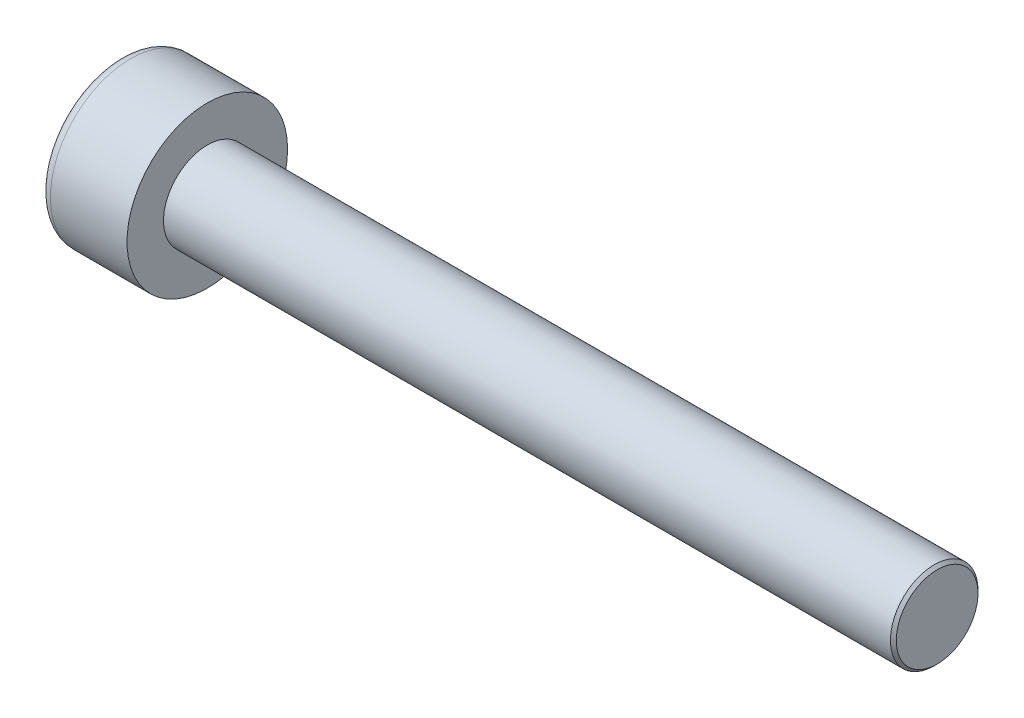
ISO-10303-21;
HEADER;
FILE_DESCRIPTION(('STEP AP214'),'2;1');
FILE_NAME('part.step','',(''),(''),'','','');
FILE_SCHEMA(('AUTOMOTIVE_DESIGN { 1 0 10303 214 1 1 1 1 }'));
ENDSEC;
DATA;
#1=APPLICATION_CONTEXT('core data for automotive mechanical design processes');
#2=APPLICATION_PROTOCOL_DEFINITION('international standard','automotive_design',2000,#1);
#3=PRODUCT_CONTEXT('',#1,'mechanical');
#4=PRODUCT('Part','Part','',(#3));
#5=PRODUCT_RELATED_PRODUCT_CATEGORY('part','',(#4));
#6=PRODUCT_DEFINITION_FORMATION('','',#4);
#7=PRODUCT_DEFINITION_CONTEXT('part definition',#1,'design');
#8=PRODUCT_DEFINITION('design','',#6,#7);
#9=PRODUCT_DEFINITION_SHAPE('','',#8);
#10=(LENGTH_UNIT() NAMED_UNIT(*) SI_UNIT(.MILLI.,.METRE.));
#11=(NAMED_UNIT(*) PLANE_ANGLE_UNIT() SI_UNIT($,.RADIAN.));
#12=(NAMED_UNIT(*) SI_UNIT($,.STERADIAN.) SOLID_ANGLE_UNIT());
#13=UNCERTAINTY_MEASURE_WITH_UNIT(LENGTH_MEASURE(1.E-05),#10,'distance_accuracy_value','');
#14=(GEOMETRIC_REPRESENTATION_CONTEXT(3) GLOBAL_UNCERTAINTY_ASSIGNED_CONTEXT((#13)) GLOBAL_UNIT_ASSIGNED_CONTEXT((#10,
#11,#12)) REPRESENTATION_CONTEXT('',''));
#15=CARTESIAN_POINT('',(0.,0.,0.));
#16=DIRECTION('',(0.,0.,1.));
#17=DIRECTION('',(1.,0.,0.));
#18=AXIS2_PLACEMENT_3D('',#15,#16,#17);
#19=CARTESIAN_POINT('',(1.3,-2.5,0.));
#20=DIRECTION('',(-1.,0.,0.));
#21=DIRECTION('',(0.,0.,1.));
#22=AXIS2_PLACEMENT_3D('',#19,#20,#21);
#23=PLANE('',#22);
#24=DIRECTION('',(0.,-0.866025403784438,-0.5));
#25=VECTOR('',#24,1.);
#26=CARTESIAN_POINT('',(1.3,0.,1.44337567297406));
#27=LINE('',#26,#25);
#28=CARTESIAN_POINT('',(1.3,-0.625,1.08253175473055));
#29=VERTEX_POINT('',#28);
#30=CARTESIAN_POINT('',(1.3,-1.25,0.721687836487032));
#31=VERTEX_POINT('',#30);
#32=EDGE_CURVE('E159',#29,#31,#27,.T.);
#33=ORIENTED_EDGE('',*,*,#32,.F.);
#34=CARTESIAN_POINT('',(1.3,0.,0.));
#35=DIRECTION('',(-1.,0.,0.));
#36=DIRECTION('',(0.,0.,1.));
#37=AXIS2_PLACEMENT_3D('',#34,#35,#36);
#38=CIRCLE('',#37,1.25);
#39=CARTESIAN_POINT('',(1.3,-1.25,0.));
#40=VERTEX_POINT('',#39);
#41=EDGE_CURVE('E54',#29,#40,#38,.F.);
#42=ORIENTED_EDGE('',*,*,#41,.T.);
#43=DIRECTION('',(0.,0.,-1.));
#44=VECTOR('',#43,1.);
#45=CARTESIAN_POINT('',(1.3,-1.25,0.721687836487032));
#46=LINE('',#45,#44);
#47=EDGE_CURVE('E164',#31,#40,#46,.T.);
#48=ORIENTED_EDGE('',*,*,#47,.F.);
#49=EDGE_LOOP('',(#33,#42,#48));
#50=FACE_BOUND('',#49,.T.);
#51=ADVANCED_FACE('F39',(#50),#23,.T.);
#52=CARTESIAN_POINT('',(1.3,-1.25,-0.721687836487033));
#53=VERTEX_POINT('',#52);
#54=EDGE_CURVE('E163',#40,#53,#46,.T.);
#55=ORIENTED_EDGE('',*,*,#54,.F.);
#56=CARTESIAN_POINT('',(1.3,-0.625,-1.08253175473055));
#57=VERTEX_POINT('',#56);
#58=EDGE_CURVE('E139',#40,#57,#38,.F.);
#59=ORIENTED_EDGE('',*,*,#58,.T.);
#60=DIRECTION('',(0.,0.866025403784439,-0.5));
#61=VECTOR('',#60,1.);
#62=CARTESIAN_POINT('',(1.3,-1.25,-0.721687836487033));
#63=LINE('',#62,#61);
#64=EDGE_CURVE('E147',#53,#57,#63,.T.);
#65=ORIENTED_EDGE('',*,*,#64,.F.);
#66=EDGE_LOOP('',(#55,#59,#65));
#67=FACE_BOUND('',#66,.T.);
#68=ADVANCED_FACE('F220',(#67),#23,.T.);
#69=CARTESIAN_POINT('',(1.3,0.,-1.44337567297406));
#70=VERTEX_POINT('',#69);
#71=EDGE_CURVE('E137',#57,#70,#63,.T.);
#72=ORIENTED_EDGE('',*,*,#71,.F.);
#73=CARTESIAN_POINT('',(1.3,0.625,-1.08253175473055));
#74=VERTEX_POINT('',#73);
#75=EDGE_CURVE('E121',#57,#74,#38,.F.);
#76=ORIENTED_EDGE('',*,*,#75,.T.);
#77=DIRECTION('',(0.,0.866025403784438,0.5));
#78=VECTOR('',#77,1.);
#79=CARTESIAN_POINT('',(1.3,0.,-1.44337567297406));
#80=LINE('',#79,#78);
#81=EDGE_CURVE('E135',#70,#74,#80,.T.);
#82=ORIENTED_EDGE('',*,*,#81,.F.);
#83=EDGE_LOOP('',(#72,#76,#82));
#84=FACE_BOUND('',#83,.T.);
#85=ADVANCED_FACE('F133',(#84),#23,.T.);
#86=CARTESIAN_POINT('',(1.3,1.25,-0.721687836487032));
#87=VERTEX_POINT('',#86);
#88=EDGE_CURVE('E141',#74,#87,#80,.T.);
#89=ORIENTED_EDGE('',*,*,#88,.F.);
#90=CARTESIAN_POINT('',(1.3,0.,0.));
#91=DIRECTION('',(1.,0.,0.));
#92=DIRECTION('',(0.,0.,-1.));
#93=AXIS2_PLACEMENT_3D('',#90,#91,#92);
#94=CIRCLE('',#93,1.25);
#95=CARTESIAN_POINT('',(1.3,1.25,0.));
#96=VERTEX_POINT('',#95);
#97=EDGE_CURVE('E119',#74,#96,#94,.T.);
#98=ORIENTED_EDGE('',*,*,#97,.T.);
#99=DIRECTION('',(0.,0.,1.));
#100=VECTOR('',#99,1.);
#101=CARTESIAN_POINT('',(1.3,1.25,-0.721687836487032));
#102=LINE('',#101,#100);
#103=EDGE_CURVE('E144',#87,#96,#102,.T.);
#104=ORIENTED_EDGE('',*,*,#103,.F.);
#105=EDGE_LOOP('',(#89,#98,#104));
#106=FACE_BOUND('',#105,.T.);
#107=ADVANCED_FACE('F142',(#106),#23,.T.);
#108=CARTESIAN_POINT('',(1.3,1.25,0.721687836487032));
#109=VERTEX_POINT('',#108);
#110=EDGE_CURVE('E151',#96,#109,#102,.T.);
#111=ORIENTED_EDGE('',*,*,#110,.F.);
#112=CARTESIAN_POINT('',(1.3,0.625,1.08253175473055));
#113=VERTEX_POINT('',#112);
#114=EDGE_CURVE('E124',#96,#113,#38,.F.);
#115=ORIENTED_EDGE('',*,*,#114,.T.);
#116=DIRECTION('',(0.,-0.866025403784438,0.5));
#117=VECTOR('',#116,1.);
#118=CARTESIAN_POINT('',(1.3,1.25,0.721687836487032));
#119=LINE('',#118,#117);
#120=EDGE_CURVE('E156',#109,#113,#119,.T.);
#121=ORIENTED_EDGE('',*,*,#120,.F.);
#122=EDGE_LOOP('',(#111,#115,#121));
#123=FACE_BOUND('',#122,.T.);
#124=ADVANCED_FACE('F232',(#123),#23,.T.);
#125=CARTESIAN_POINT('',(1.3,0.,1.44337567297406));
#126=VERTEX_POINT('',#125);
#127=EDGE_CURVE('E155',#113,#126,#119,.T.);
#128=ORIENTED_EDGE('',*,*,#127,.F.);
#129=EDGE_CURVE('E200',#113,#29,#38,.F.);
#130=ORIENTED_EDGE('',*,*,#129,.T.);
#131=EDGE_CURVE('E160',#126,#29,#27,.T.);
#132=ORIENTED_EDGE('',*,*,#131,.F.);
#133=EDGE_LOOP('',(#128,#130,#132));
#134=FACE_BOUND('',#133,.T.);
#135=ADVANCED_FACE('F223',(#134),#23,.T.);
#136=CARTESIAN_POINT('',(0.,0.,0.));
#137=DIRECTION('',(1.,0.,0.));
#138=DIRECTION('',(0.,0.,-1.));
#139=AXIS2_PLACEMENT_3D('',#136,#137,#138);
#140=PLANE('',#139);
#141=CARTESIAN_POINT('',(0.,0.,0.));
#142=DIRECTION('',(1.,0.,0.));
#143=DIRECTION('',(0.,0.,-1.));
#144=AXIS2_PLACEMENT_3D('',#141,#142,#143);
#145=CIRCLE('',#144,2.375);
#146=CARTESIAN_POINT('',(0.,0.,-2.375));
#147=VERTEX_POINT('',#146);
#148=EDGE_CURVE('E205',#147,#147,#145,.F.);
#149=ORIENTED_EDGE('',*,*,#148,.T.);
#150=EDGE_LOOP('',(#149));
#151=FACE_BOUND('',#150,.T.);
#152=DIRECTION('',(0.,0.866025403784439,-0.5));
#153=VECTOR('',#152,1.);
#154=CARTESIAN_POINT('',(0.,-1.25,-0.721687836487033));
#155=LINE('',#154,#153);
#156=CARTESIAN_POINT('',(0.,-1.25,-0.721687836487033));
#157=VERTEX_POINT('',#156);
#158=CARTESIAN_POINT('',(0.,0.,-1.44337567297406));
#159=VERTEX_POINT('',#158);
#160=EDGE_CURVE('E62',#157,#159,#155,.T.);
#161=ORIENTED_EDGE('',*,*,#160,.T.);
#162=DIRECTION('',(0.,0.866025403784438,0.5));
#163=VECTOR('',#162,1.);
#164=CARTESIAN_POINT('',(0.,0.,-1.44337567297406));
#165=LINE('',#164,#163);
#166=CARTESIAN_POINT('',(0.,1.25,-0.721687836487032));
#167=VERTEX_POINT('',#166);
#168=EDGE_CURVE('E169',#159,#167,#165,.T.);
#169=ORIENTED_EDGE('',*,*,#168,.T.);
#170=DIRECTION('',(0.,0.,1.));
#171=VECTOR('',#170,1.);
#172=CARTESIAN_POINT('',(0.,1.25,-0.721687836487032));
#173=LINE('',#172,#171);
#174=CARTESIAN_POINT('',(0.,1.25,0.721687836487032));
#175=VERTEX_POINT('',#174);
#176=EDGE_CURVE('E172',#167,#175,#173,.T.);
#177=ORIENTED_EDGE('',*,*,#176,.T.);
#178=DIRECTION('',(0.,-0.866025403784438,0.5));
#179=VECTOR('',#178,1.);
#180=CARTESIAN_POINT('',(0.,1.25,0.721687836487032));
#181=LINE('',#180,#179);
#182=CARTESIAN_POINT('',(0.,0.,1.44337567297406));
#183=VERTEX_POINT('',#182);
#184=EDGE_CURVE('E175',#175,#183,#181,.T.);
#185=ORIENTED_EDGE('',*,*,#184,.T.);
#186=DIRECTION('',(0.,-0.866025403784438,-0.5));
#187=VECTOR('',#186,1.);
#188=CARTESIAN_POINT('',(0.,0.,1.44337567297406));
#189=LINE('',#188,#187);
#190=CARTESIAN_POINT('',(0.,-1.25,0.721687836487032));
#191=VERTEX_POINT('',#190);
#192=EDGE_CURVE('E178',#183,#191,#189,.T.);
#193=ORIENTED_EDGE('',*,*,#192,.T.);
#194=DIRECTION('',(0.,0.,-1.));
#195=VECTOR('',#194,1.);
#196=CARTESIAN_POINT('',(0.,-1.25,0.721687836487032));
#197=LINE('',#196,#195);
#198=EDGE_CURVE('E181',#191,#157,#197,.T.);
#199=ORIENTED_EDGE('',*,*,#198,.T.);
#200=EDGE_LOOP('',(#161,#169,#177,#185,#193,#199));
#201=FACE_BOUND('',#200,.T.);
#202=ADVANCED_FACE('F231',(#151,#201),#140,.F.);
#203=CARTESIAN_POINT('',(3.,0.,0.));
#204=DIRECTION('',(1.,0.,0.));
#205=DIRECTION('',(0.,0.,-1.));
#206=AXIS2_PLACEMENT_3D('',#203,#204,#205);
#207=PLANE('',#206);
#208=CARTESIAN_POINT('',(3.,0.,0.));
#209=DIRECTION('',(1.,0.,0.));
#210=DIRECTION('',(0.,0.,-1.));
#211=AXIS2_PLACEMENT_3D('',#208,#209,#210);
#212=CIRCLE('',#211,2.75);
#213=CARTESIAN_POINT('',(3.,0.,-2.75));
#214=VERTEX_POINT('',#213);
#215=EDGE_CURVE('E197',#214,#214,#212,.T.);
#216=ORIENTED_EDGE('',*,*,#215,.T.);
#217=EDGE_LOOP('',(#216));
#218=FACE_BOUND('',#217,.T.);
#219=CARTESIAN_POINT('',(3.,0.,0.));
#220=DIRECTION('',(1.,0.,0.));
#221=DIRECTION('',(0.,0.,-1.));
#222=AXIS2_PLACEMENT_3D('',#219,#220,#221);
#223=CIRCLE('',#222,1.5);
#224=CARTESIAN_POINT('',(3.,0.,-1.5));
#225=VERTEX_POINT('',#224);
#226=EDGE_CURVE('E194',#225,#225,#223,.T.);
#227=ORIENTED_EDGE('',*,*,#226,.F.);
#228=EDGE_LOOP('',(#227));
#229=FACE_BOUND('',#228,.T.);
#230=ADVANCED_FACE('F238',(#218,#229),#207,.T.);
#231=CARTESIAN_POINT('',(3.,0.,0.));
#232=DIRECTION('',(-1.,0.,0.));
#233=DIRECTION('',(0.,0.,1.));
#234=AXIS2_PLACEMENT_3D('',#231,#232,#233);
#235=CYLINDRICAL_SURFACE('',#234,2.75);
#236=CARTESIAN_POINT('',(0.375,0.,0.));
#237=DIRECTION('',(1.,0.,0.));
#238=DIRECTION('',(0.,0.,-1.));
#239=AXIS2_PLACEMENT_3D('',#236,#237,#238);
#240=CIRCLE('',#239,2.75);
#241=CARTESIAN_POINT('',(0.375,0.,-2.75));
#242=VERTEX_POINT('',#241);
#243=EDGE_CURVE('E202',#242,#242,#240,.T.);
#244=ORIENTED_EDGE('',*,*,#243,.T.);
#245=EDGE_LOOP('',(#244));
#246=FACE_BOUND('',#245,.T.);
#247=ORIENTED_EDGE('',*,*,#215,.F.);
#248=EDGE_LOOP('',(#247));
#249=FACE_BOUND('',#248,.T.);
#250=ADVANCED_FACE('F283',(#246,#249),#235,.T.);
#251=CARTESIAN_POINT('',(28.,0.,0.));
#252=DIRECTION('',(-1.,0.,0.));
#253=DIRECTION('',(0.,0.,1.));
#254=AXIS2_PLACEMENT_3D('',#251,#252,#253);
#255=CYLINDRICAL_SURFACE('',#254,1.5);
#256=CARTESIAN_POINT('',(27.9,0.,0.));
#257=DIRECTION('',(1.,0.,0.));
#258=DIRECTION('',(0.,0.,-1.));
#259=AXIS2_PLACEMENT_3D('',#256,#257,#258);
#260=CIRCLE('',#259,1.5);
#261=CARTESIAN_POINT('',(27.9,0.,-1.5));
#262=VERTEX_POINT('',#261);
#263=EDGE_CURVE('E11',#262,#262,#260,.F.);
#264=ORIENTED_EDGE('',*,*,#263,.T.);
#265=EDGE_LOOP('',(#264));
#266=FACE_BOUND('',#265,.T.);
#267=ORIENTED_EDGE('',*,*,#226,.T.);
#268=EDGE_LOOP('',(#267));
#269=FACE_BOUND('',#268,.T.);
#270=ADVANCED_FACE('F280',(#266,#269),#255,.T.);
#271=CARTESIAN_POINT('',(28.,0.,0.));
#272=DIRECTION('',(1.,0.,0.));
#273=DIRECTION('',(0.,0.,-1.));
#274=AXIS2_PLACEMENT_3D('',#271,#272,#273);
#275=PLANE('',#274);
#276=CARTESIAN_POINT('',(28.,0.,0.));
#277=DIRECTION('',(1.,0.,0.));
#278=DIRECTION('',(0.,0.,-1.));
#279=AXIS2_PLACEMENT_3D('',#276,#277,#278);
#280=CIRCLE('',#279,1.40000000000001);
#281=CARTESIAN_POINT('',(28.,0.,-1.40000000000001));
#282=VERTEX_POINT('',#281);
#283=EDGE_CURVE('E47',#282,#282,#280,.T.);
#284=ORIENTED_EDGE('',*,*,#283,.T.);
#285=EDGE_LOOP('',(#284));
#286=FACE_BOUND('',#285,.T.);
#287=ADVANCED_FACE('F210',(#286),#275,.T.);
#288=CARTESIAN_POINT('',(1.3,-1.25,-0.721687836487033));
#289=DIRECTION('',(0.,0.5,0.866025403784439));
#290=DIRECTION('',(0.,-0.866025403784439,0.5));
#291=AXIS2_PLACEMENT_3D('',#288,#289,#290);
#292=PLANE('',#291);
#293=ORIENTED_EDGE('',*,*,#160,.F.);
#294=DIRECTION('',(-1.,0.,0.));
#295=VECTOR('',#294,1.);
#296=CARTESIAN_POINT('',(1.3,-1.25,-0.721687836487033));
#297=LINE('',#296,#295);
#298=EDGE_CURVE('E167',#53,#157,#297,.T.);
#299=ORIENTED_EDGE('',*,*,#298,.F.);
#300=ORIENTED_EDGE('',*,*,#64,.T.);
#301=ORIENTED_EDGE('',*,*,#71,.T.);
#302=DIRECTION('',(-1.,0.,0.));
#303=VECTOR('',#302,1.);
#304=CARTESIAN_POINT('',(1.3,0.,-1.44337567297406));
#305=LINE('',#304,#303);
#306=EDGE_CURVE('E150',#70,#159,#305,.T.);
#307=ORIENTED_EDGE('',*,*,#306,.T.);
#308=EDGE_LOOP('',(#293,#299,#300,#301,#307));
#309=FACE_BOUND('',#308,.T.);
#310=ADVANCED_FACE('F254',(#309),#292,.T.);
#311=CARTESIAN_POINT('',(1.3,0.,-1.44337567297406));
#312=DIRECTION('',(0.,-0.5,0.866025403784439));
#313=DIRECTION('',(0.,-0.866025403784439,-0.5));
#314=AXIS2_PLACEMENT_3D('',#311,#312,#313);
#315=PLANE('',#314);
#316=ORIENTED_EDGE('',*,*,#168,.F.);
#317=ORIENTED_EDGE('',*,*,#306,.F.);
#318=ORIENTED_EDGE('',*,*,#81,.T.);
#319=ORIENTED_EDGE('',*,*,#88,.T.);
#320=DIRECTION('',(-1.,0.,0.));
#321=VECTOR('',#320,1.);
#322=CARTESIAN_POINT('',(1.3,1.25,-0.721687836487032));
#323=LINE('',#322,#321);
#324=EDGE_CURVE('E191',#87,#167,#323,.T.);
#325=ORIENTED_EDGE('',*,*,#324,.T.);
#326=EDGE_LOOP('',(#316,#317,#318,#319,#325));
#327=FACE_BOUND('',#326,.T.);
#328=ADVANCED_FACE('F149',(#327),#315,.T.);
#329=CARTESIAN_POINT('',(1.3,1.25,-0.721687836487032));
#330=DIRECTION('',(0.,-1.,0.));
#331=DIRECTION('',(0.,0.,-1.));
#332=AXIS2_PLACEMENT_3D('',#329,#330,#331);
#333=PLANE('',#332);
#334=ORIENTED_EDGE('',*,*,#176,.F.);
#335=ORIENTED_EDGE('',*,*,#324,.F.);
#336=ORIENTED_EDGE('',*,*,#103,.T.);
#337=ORIENTED_EDGE('',*,*,#110,.T.);
#338=DIRECTION('',(-1.,0.,0.));
#339=VECTOR('',#338,1.);
#340=CARTESIAN_POINT('',(1.3,1.25,0.721687836487032));
#341=LINE('',#340,#339);
#342=EDGE_CURVE('E189',#109,#175,#341,.T.);
#343=ORIENTED_EDGE('',*,*,#342,.T.);
#344=EDGE_LOOP('',(#334,#335,#336,#337,#343));
#345=FACE_BOUND('',#344,.T.);
#346=ADVANCED_FACE('F252',(#345),#333,.T.);
#347=CARTESIAN_POINT('',(1.3,1.25,0.721687836487032));
#348=DIRECTION('',(0.,-0.5,-0.866025403784439));
#349=DIRECTION('',(0.,0.866025403784439,-0.5));
#350=AXIS2_PLACEMENT_3D('',#347,#348,#349);
#351=PLANE('',#350);
#352=ORIENTED_EDGE('',*,*,#184,.F.);
#353=ORIENTED_EDGE('',*,*,#342,.F.);
#354=ORIENTED_EDGE('',*,*,#120,.T.);
#355=ORIENTED_EDGE('',*,*,#127,.T.);
#356=DIRECTION('',(-1.,0.,0.));
#357=VECTOR('',#356,1.);
#358=CARTESIAN_POINT('',(1.3,0.,1.44337567297406));
#359=LINE('',#358,#357);
#360=EDGE_CURVE('E187',#126,#183,#359,.T.);
#361=ORIENTED_EDGE('',*,*,#360,.T.);
#362=EDGE_LOOP('',(#352,#353,#354,#355,#361));
#363=FACE_BOUND('',#362,.T.);
#364=ADVANCED_FACE('F249',(#363),#351,.T.);
#365=CARTESIAN_POINT('',(1.3,0.,1.44337567297406));
#366=DIRECTION('',(0.,0.5,-0.866025403784438));
#367=DIRECTION('',(0.,0.866025403784438,0.5));
#368=AXIS2_PLACEMENT_3D('',#365,#366,#367);
#369=PLANE('',#368);
#370=ORIENTED_EDGE('',*,*,#192,.F.);
#371=ORIENTED_EDGE('',*,*,#360,.F.);
#372=ORIENTED_EDGE('',*,*,#131,.T.);
#373=ORIENTED_EDGE('',*,*,#32,.T.);
#374=DIRECTION('',(-1.,0.,0.));
#375=VECTOR('',#374,1.);
#376=CARTESIAN_POINT('',(1.3,-1.25,0.721687836487032));
#377=LINE('',#376,#375);
#378=EDGE_CURVE('E185',#31,#191,#377,.T.);
#379=ORIENTED_EDGE('',*,*,#378,.T.);
#380=EDGE_LOOP('',(#370,#371,#372,#373,#379));
#381=FACE_BOUND('',#380,.T.);
#382=ADVANCED_FACE('F263',(#381),#369,.T.);
#383=CARTESIAN_POINT('',(1.3,-1.25,0.721687836487032));
#384=DIRECTION('',(0.,1.,0.));
#385=DIRECTION('',(0.,0.,1.));
#386=AXIS2_PLACEMENT_3D('',#383,#384,#385);
#387=PLANE('',#386);
#388=ORIENTED_EDGE('',*,*,#198,.F.);
#389=ORIENTED_EDGE('',*,*,#378,.F.);
#390=ORIENTED_EDGE('',*,*,#47,.T.);
#391=ORIENTED_EDGE('',*,*,#54,.T.);
#392=ORIENTED_EDGE('',*,*,#298,.T.);
#393=EDGE_LOOP('',(#388,#389,#390,#391,#392));
#394=FACE_BOUND('',#393,.T.);
#395=ADVANCED_FACE('F116',(#394),#387,.T.);
#396=CARTESIAN_POINT('',(1.3,0.,0.));
#397=DIRECTION('',(-1.,0.,0.));
#398=DIRECTION('',(0.,0.,1.));
#399=AXIS2_PLACEMENT_3D('',#396,#397,#398);
#400=CONICAL_SURFACE('',#399,1.25,1.04719755119659);
#401=CARTESIAN_POINT('',(2.02168783648704,0.,0.));
#402=VERTEX_POINT('',#401);
#403=VERTEX_LOOP('',#402);
#404=FACE_BOUND('',#403,.T.);
#405=ORIENTED_EDGE('',*,*,#97,.F.);
#406=ORIENTED_EDGE('',*,*,#75,.F.);
#407=ORIENTED_EDGE('',*,*,#58,.F.);
#408=ORIENTED_EDGE('',*,*,#41,.F.);
#409=ORIENTED_EDGE('',*,*,#129,.F.);
#410=ORIENTED_EDGE('',*,*,#114,.F.);
#411=EDGE_LOOP('',(#405,#406,#407,#408,#409,#410));
#412=FACE_BOUND('',#411,.T.);
#413=ADVANCED_FACE('F113',(#404,#412),#400,.F.);
#414=CARTESIAN_POINT('',(0.375,0.,0.));
#415=DIRECTION('',(1.,0.,0.));
#416=DIRECTION('',(0.,0.,-1.));
#417=AXIS2_PLACEMENT_3D('',#414,#415,#416);
#418=TOROIDAL_SURFACE('',#417,2.375,0.375);
#419=ORIENTED_EDGE('',*,*,#148,.F.);
#420=EDGE_LOOP('',(#419));
#421=FACE_BOUND('',#420,.T.);
#422=ORIENTED_EDGE('',*,*,#243,.F.);
#423=EDGE_LOOP('',(#422));
#424=FACE_BOUND('',#423,.T.);
#425=ADVANCED_FACE('F115',(#421,#424),#418,.T.);
#426=CARTESIAN_POINT('',(28.,0.,0.));
#427=DIRECTION('',(-1.,0.,0.));
#428=DIRECTION('',(0.,0.,1.));
#429=AXIS2_PLACEMENT_3D('',#426,#427,#428);
#430=CONICAL_SURFACE('',#429,1.40000000000001,0.785398163397443);
#431=ORIENTED_EDGE('',*,*,#263,.F.);
#432=EDGE_LOOP('',(#431));
#433=FACE_BOUND('',#432,.T.);
#434=ORIENTED_EDGE('',*,*,#283,.F.);
#435=EDGE_LOOP('',(#434));
#436=FACE_BOUND('',#435,.T.);
#437=ADVANCED_FACE('F41',(#433,#436),#430,.T.);
#438=CLOSED_SHELL('',(#51,#68,#85,#107,#124,#135,#202,#230,#250,#270,#287,#310,#328,#346,#364,
#382,#395,#413,#425,#437));
#439=MANIFOLD_SOLID_BREP('B2',#438);
#440=ADVANCED_BREP_SHAPE_REPRESENTATION('',(#18,#439),#14);
#441=SHAPE_DEFINITION_REPRESENTATION(#9,#440);
ENDSEC;
END-ISO-10303-21;
